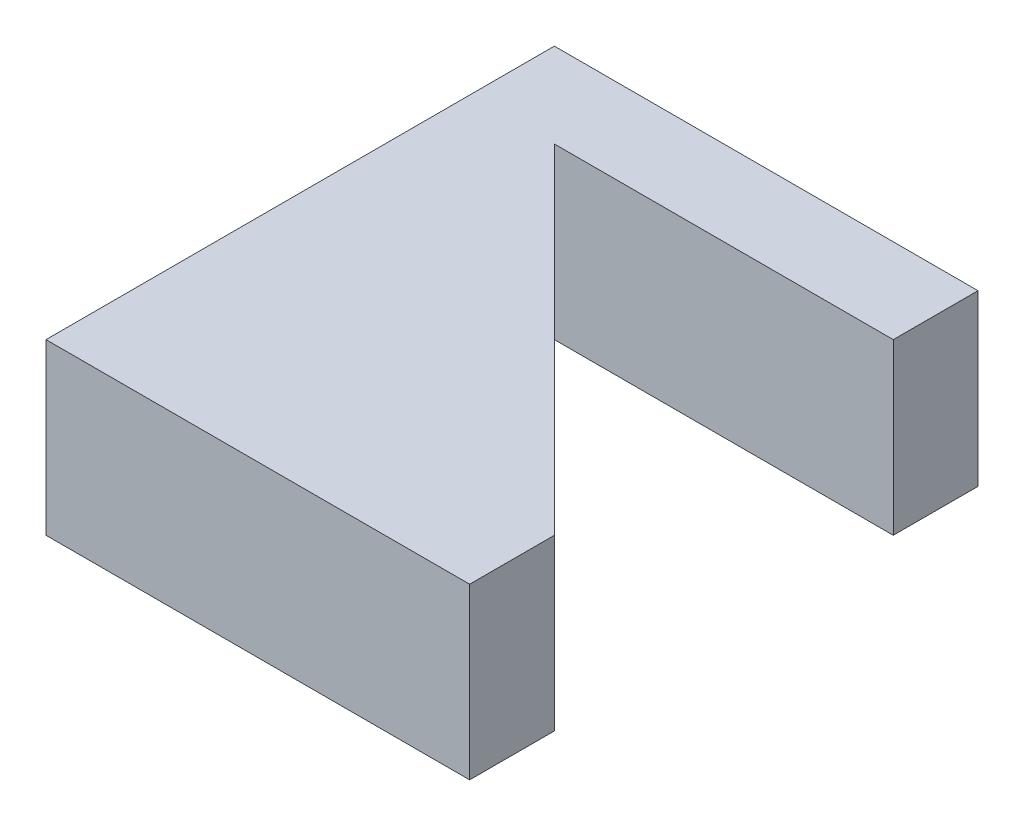
ISO-10303-21;
HEADER;
FILE_DESCRIPTION(('STEP AP214'),'2;1');
FILE_NAME('part.step','',(''),(''),'','','');
FILE_SCHEMA(('AUTOMOTIVE_DESIGN { 1 0 10303 214 1 1 1 1 }'));
ENDSEC;
DATA;
#1=APPLICATION_CONTEXT('core data for automotive mechanical design processes');
#2=APPLICATION_PROTOCOL_DEFINITION('international standard','automotive_design',2000,#1);
#3=PRODUCT_CONTEXT('',#1,'mechanical');
#4=PRODUCT('Part','Part','',(#3));
#5=PRODUCT_RELATED_PRODUCT_CATEGORY('part','',(#4));
#6=PRODUCT_DEFINITION_FORMATION('','',#4);
#7=PRODUCT_DEFINITION_CONTEXT('part definition',#1,'design');
#8=PRODUCT_DEFINITION('design','',#6,#7);
#9=PRODUCT_DEFINITION_SHAPE('','',#8);
#10=(LENGTH_UNIT() NAMED_UNIT(*) SI_UNIT(.MILLI.,.METRE.));
#11=(NAMED_UNIT(*) PLANE_ANGLE_UNIT() SI_UNIT($,.RADIAN.));
#12=(NAMED_UNIT(*) SI_UNIT($,.STERADIAN.) SOLID_ANGLE_UNIT());
#13=UNCERTAINTY_MEASURE_WITH_UNIT(LENGTH_MEASURE(1.E-05),#10,'distance_accuracy_value','');
#14=(GEOMETRIC_REPRESENTATION_CONTEXT(3) GLOBAL_UNCERTAINTY_ASSIGNED_CONTEXT((#13)) GLOBAL_UNIT_ASSIGNED_CONTEXT((#10,
#11,#12)) REPRESENTATION_CONTEXT('',''));
#15=CARTESIAN_POINT('',(0.,0.,0.));
#16=DIRECTION('',(0.,0.,1.));
#17=DIRECTION('',(1.,0.,0.));
#18=AXIS2_PLACEMENT_3D('',#15,#16,#17);
#19=CARTESIAN_POINT('',(10.,20.,10.));
#20=DIRECTION('',(0.,0.,-1.));
#21=DIRECTION('',(-1.,0.,0.));
#22=AXIS2_PLACEMENT_3D('',#19,#20,#21);
#23=PLANE('',#22);
#24=DIRECTION('',(1.,0.,0.));
#25=VECTOR('',#24,1.);
#26=CARTESIAN_POINT('',(10.,0.,10.));
#27=LINE('',#26,#25);
#28=CARTESIAN_POINT('',(10.,0.,10.));
#29=VERTEX_POINT('',#28);
#30=CARTESIAN_POINT('',(50.,0.,10.));
#31=VERTEX_POINT('',#30);
#32=EDGE_CURVE('E128',#29,#31,#27,.T.);
#33=ORIENTED_EDGE('',*,*,#32,.T.);
#34=DIRECTION('',(0.,-1.,0.));
#35=VECTOR('',#34,1.);
#36=CARTESIAN_POINT('',(50.,20.,10.));
#37=LINE('',#36,#35);
#38=CARTESIAN_POINT('',(50.,20.,10.));
#39=VERTEX_POINT('',#38);
#40=EDGE_CURVE('E11',#39,#31,#37,.T.);
#41=ORIENTED_EDGE('',*,*,#40,.F.);
#42=DIRECTION('',(1.,0.,0.));
#43=VECTOR('',#42,1.);
#44=CARTESIAN_POINT('',(10.,20.,10.));
#45=LINE('',#44,#43);
#46=CARTESIAN_POINT('',(10.,20.,10.));
#47=VERTEX_POINT('',#46);
#48=EDGE_CURVE('E142',#47,#39,#45,.T.);
#49=ORIENTED_EDGE('',*,*,#48,.F.);
#50=DIRECTION('',(0.,-1.,0.));
#51=VECTOR('',#50,1.);
#52=CARTESIAN_POINT('',(10.,20.,10.));
#53=LINE('',#52,#51);
#54=EDGE_CURVE('E53',#47,#29,#53,.T.);
#55=ORIENTED_EDGE('',*,*,#54,.T.);
#56=EDGE_LOOP('',(#33,#41,#49,#55));
#57=FACE_BOUND('',#56,.T.);
#58=ADVANCED_FACE('F37',(#57),#23,.F.);
#59=CARTESIAN_POINT('',(50.,20.,10.));
#60=DIRECTION('',(-1.,0.,0.));
#61=DIRECTION('',(0.,0.,1.));
#62=AXIS2_PLACEMENT_3D('',#59,#60,#61);
#63=PLANE('',#62);
#64=DIRECTION('',(0.,0.,-1.));
#65=VECTOR('',#64,1.);
#66=CARTESIAN_POINT('',(50.,0.,10.));
#67=LINE('',#66,#65);
#68=CARTESIAN_POINT('',(50.,0.,0.));
#69=VERTEX_POINT('',#68);
#70=EDGE_CURVE('E130',#31,#69,#67,.T.);
#71=ORIENTED_EDGE('',*,*,#70,.T.);
#72=DIRECTION('',(0.,-1.,0.));
#73=VECTOR('',#72,1.);
#74=CARTESIAN_POINT('',(50.,20.,0.));
#75=LINE('',#74,#73);
#76=CARTESIAN_POINT('',(50.,20.,0.));
#77=VERTEX_POINT('',#76);
#78=EDGE_CURVE('E45',#77,#69,#75,.T.);
#79=ORIENTED_EDGE('',*,*,#78,.F.);
#80=DIRECTION('',(0.,0.,-1.));
#81=VECTOR('',#80,1.);
#82=CARTESIAN_POINT('',(50.,20.,10.));
#83=LINE('',#82,#81);
#84=EDGE_CURVE('E89',#39,#77,#83,.T.);
#85=ORIENTED_EDGE('',*,*,#84,.F.);
#86=ORIENTED_EDGE('',*,*,#40,.T.);
#87=EDGE_LOOP('',(#71,#79,#85,#86));
#88=FACE_BOUND('',#87,.T.);
#89=ADVANCED_FACE('F164',(#88),#63,.F.);
#90=CARTESIAN_POINT('',(50.,20.,0.));
#91=DIRECTION('',(0.,0.,1.));
#92=DIRECTION('',(1.,0.,0.));
#93=AXIS2_PLACEMENT_3D('',#90,#91,#92);
#94=PLANE('',#93);
#95=DIRECTION('',(-1.,0.,0.));
#96=VECTOR('',#95,1.);
#97=CARTESIAN_POINT('',(50.,0.,0.));
#98=LINE('',#97,#96);
#99=CARTESIAN_POINT('',(0.,0.,0.));
#100=VERTEX_POINT('',#99);
#101=EDGE_CURVE('E132',#69,#100,#98,.T.);
#102=ORIENTED_EDGE('',*,*,#101,.T.);
#103=DIRECTION('',(0.,-1.,0.));
#104=VECTOR('',#103,1.);
#105=CARTESIAN_POINT('',(0.,20.,0.));
#106=LINE('',#105,#104);
#107=CARTESIAN_POINT('',(0.,20.,0.));
#108=VERTEX_POINT('',#107);
#109=EDGE_CURVE('E146',#108,#100,#106,.T.);
#110=ORIENTED_EDGE('',*,*,#109,.F.);
#111=DIRECTION('',(-1.,0.,0.));
#112=VECTOR('',#111,1.);
#113=CARTESIAN_POINT('',(50.,20.,0.));
#114=LINE('',#113,#112);
#115=EDGE_CURVE('E154',#77,#108,#114,.T.);
#116=ORIENTED_EDGE('',*,*,#115,.F.);
#117=ORIENTED_EDGE('',*,*,#78,.T.);
#118=EDGE_LOOP('',(#102,#110,#116,#117));
#119=FACE_BOUND('',#118,.T.);
#120=ADVANCED_FACE('F152',(#119),#94,.F.);
#121=CARTESIAN_POINT('',(0.,20.,0.));
#122=DIRECTION('',(1.,0.,0.));
#123=DIRECTION('',(0.,0.,-1.));
#124=AXIS2_PLACEMENT_3D('',#121,#122,#123);
#125=PLANE('',#124);
#126=DIRECTION('',(0.,0.,1.));
#127=VECTOR('',#126,1.);
#128=CARTESIAN_POINT('',(0.,0.,0.));
#129=LINE('',#128,#127);
#130=CARTESIAN_POINT('',(0.,0.,60.0000000000001));
#131=VERTEX_POINT('',#130);
#132=EDGE_CURVE('E134',#100,#131,#129,.T.);
#133=ORIENTED_EDGE('',*,*,#132,.T.);
#134=DIRECTION('',(0.,-1.,0.));
#135=VECTOR('',#134,1.);
#136=CARTESIAN_POINT('',(0.,20.,60.0000000000001));
#137=LINE('',#136,#135);
#138=CARTESIAN_POINT('',(0.,20.,60.0000000000001));
#139=VERTEX_POINT('',#138);
#140=EDGE_CURVE('E120',#139,#131,#137,.T.);
#141=ORIENTED_EDGE('',*,*,#140,.F.);
#142=DIRECTION('',(0.,0.,1.));
#143=VECTOR('',#142,1.);
#144=CARTESIAN_POINT('',(0.,20.,0.));
#145=LINE('',#144,#143);
#146=EDGE_CURVE('E108',#108,#139,#145,.T.);
#147=ORIENTED_EDGE('',*,*,#146,.F.);
#148=ORIENTED_EDGE('',*,*,#109,.T.);
#149=EDGE_LOOP('',(#133,#141,#147,#148));
#150=FACE_BOUND('',#149,.T.);
#151=ADVANCED_FACE('F159',(#150),#125,.F.);
#152=CARTESIAN_POINT('',(0.,20.,60.0000000000001));
#153=DIRECTION('',(0.,0.,-1.));
#154=DIRECTION('',(-1.,0.,0.));
#155=AXIS2_PLACEMENT_3D('',#152,#153,#154);
#156=PLANE('',#155);
#157=DIRECTION('',(1.,0.,0.));
#158=VECTOR('',#157,1.);
#159=CARTESIAN_POINT('',(0.,0.,60.0000000000001));
#160=LINE('',#159,#158);
#161=CARTESIAN_POINT('',(50.,0.,60.0000000000001));
#162=VERTEX_POINT('',#161);
#163=EDGE_CURVE('E117',#131,#162,#160,.T.);
#164=ORIENTED_EDGE('',*,*,#163,.T.);
#165=DIRECTION('',(0.,-1.,0.));
#166=VECTOR('',#165,1.);
#167=CARTESIAN_POINT('',(50.,20.,60.0000000000001));
#168=LINE('',#167,#166);
#169=CARTESIAN_POINT('',(50.,20.,60.0000000000001));
#170=VERTEX_POINT('',#169);
#171=EDGE_CURVE('E114',#170,#162,#168,.T.);
#172=ORIENTED_EDGE('',*,*,#171,.F.);
#173=DIRECTION('',(1.,0.,0.));
#174=VECTOR('',#173,1.);
#175=CARTESIAN_POINT('',(0.,20.,60.0000000000001));
#176=LINE('',#175,#174);
#177=EDGE_CURVE('E101',#139,#170,#176,.T.);
#178=ORIENTED_EDGE('',*,*,#177,.F.);
#179=ORIENTED_EDGE('',*,*,#140,.T.);
#180=EDGE_LOOP('',(#164,#172,#178,#179));
#181=FACE_BOUND('',#180,.T.);
#182=ADVANCED_FACE('F115',(#181),#156,.F.);
#183=CARTESIAN_POINT('',(50.,20.,60.0000000000001));
#184=DIRECTION('',(-1.,0.,0.));
#185=DIRECTION('',(0.,0.,1.));
#186=AXIS2_PLACEMENT_3D('',#183,#184,#185);
#187=PLANE('',#186);
#188=DIRECTION('',(0.,0.,-1.));
#189=VECTOR('',#188,1.);
#190=CARTESIAN_POINT('',(50.,0.,60.0000000000001));
#191=LINE('',#190,#189);
#192=CARTESIAN_POINT('',(50.,0.,50.0000000000001));
#193=VERTEX_POINT('',#192);
#194=EDGE_CURVE('E137',#162,#193,#191,.T.);
#195=ORIENTED_EDGE('',*,*,#194,.T.);
#196=DIRECTION('',(0.,-1.,0.));
#197=VECTOR('',#196,1.);
#198=CARTESIAN_POINT('',(50.,20.,50.0000000000001));
#199=LINE('',#198,#197);
#200=CARTESIAN_POINT('',(50.,20.,50.0000000000001));
#201=VERTEX_POINT('',#200);
#202=EDGE_CURVE('E77',#201,#193,#199,.T.);
#203=ORIENTED_EDGE('',*,*,#202,.F.);
#204=DIRECTION('',(0.,0.,-1.));
#205=VECTOR('',#204,1.);
#206=CARTESIAN_POINT('',(50.,20.,60.0000000000001));
#207=LINE('',#206,#205);
#208=EDGE_CURVE('E106',#170,#201,#207,.T.);
#209=ORIENTED_EDGE('',*,*,#208,.F.);
#210=ORIENTED_EDGE('',*,*,#171,.T.);
#211=EDGE_LOOP('',(#195,#203,#209,#210));
#212=FACE_BOUND('',#211,.T.);
#213=ADVANCED_FACE('F122',(#212),#187,.F.);
#214=CARTESIAN_POINT('',(10.,20.,10.));
#215=DIRECTION('',(0.707106781186549,0.,-0.707106781186546));
#216=DIRECTION('',(-0.707106781186546,0.,-0.707106781186549));
#217=AXIS2_PLACEMENT_3D('',#214,#215,#216);
#218=PLANE('',#217);
#219=DIRECTION('',(0.707106781186546,0.,0.707106781186549));
#220=VECTOR('',#219,1.);
#221=CARTESIAN_POINT('',(10.,0.,10.));
#222=LINE('',#221,#220);
#223=EDGE_CURVE('E139',#29,#193,#222,.T.);
#224=ORIENTED_EDGE('',*,*,#223,.F.);
#225=ORIENTED_EDGE('',*,*,#54,.F.);
#226=DIRECTION('',(0.707106781186546,0.,0.707106781186549));
#227=VECTOR('',#226,1.);
#228=CARTESIAN_POINT('',(10.,20.,10.));
#229=LINE('',#228,#227);
#230=EDGE_CURVE('E123',#47,#201,#229,.T.);
#231=ORIENTED_EDGE('',*,*,#230,.T.);
#232=ORIENTED_EDGE('',*,*,#202,.T.);
#233=EDGE_LOOP('',(#224,#225,#231,#232));
#234=FACE_BOUND('',#233,.T.);
#235=ADVANCED_FACE('F178',(#234),#218,.T.);
#236=CARTESIAN_POINT('',(0.,20.,0.));
#237=DIRECTION('',(0.,1.,0.));
#238=DIRECTION('',(0.,0.,1.));
#239=AXIS2_PLACEMENT_3D('',#236,#237,#238);
#240=PLANE('',#239);
#241=ORIENTED_EDGE('',*,*,#48,.T.);
#242=ORIENTED_EDGE('',*,*,#84,.T.);
#243=ORIENTED_EDGE('',*,*,#115,.T.);
#244=ORIENTED_EDGE('',*,*,#146,.T.);
#245=ORIENTED_EDGE('',*,*,#177,.T.);
#246=ORIENTED_EDGE('',*,*,#208,.T.);
#247=ORIENTED_EDGE('',*,*,#230,.F.);
#248=EDGE_LOOP('',(#241,#242,#243,#244,#245,#246,#247));
#249=FACE_BOUND('',#248,.T.);
#250=ADVANCED_FACE('F103',(#249),#240,.T.);
#251=CARTESIAN_POINT('',(0.,0.,0.));
#252=DIRECTION('',(0.,1.,0.));
#253=DIRECTION('',(0.,0.,1.));
#254=AXIS2_PLACEMENT_3D('',#251,#252,#253);
#255=PLANE('',#254);
#256=ORIENTED_EDGE('',*,*,#32,.F.);
#257=ORIENTED_EDGE('',*,*,#223,.T.);
#258=ORIENTED_EDGE('',*,*,#194,.F.);
#259=ORIENTED_EDGE('',*,*,#163,.F.);
#260=ORIENTED_EDGE('',*,*,#132,.F.);
#261=ORIENTED_EDGE('',*,*,#101,.F.);
#262=ORIENTED_EDGE('',*,*,#70,.F.);
#263=EDGE_LOOP('',(#256,#257,#258,#259,#260,#261,#262));
#264=FACE_BOUND('',#263,.T.);
#265=ADVANCED_FACE('F157',(#264),#255,.F.);
#266=CLOSED_SHELL('',(#58,#89,#120,#151,#182,#213,#235,#250,#265));
#267=MANIFOLD_SOLID_BREP('B2',#266);
#268=ADVANCED_BREP_SHAPE_REPRESENTATION('',(#18,#267),#14);
#269=SHAPE_DEFINITION_REPRESENTATION(#9,#268);
ENDSEC;
END-ISO-10303-21;
